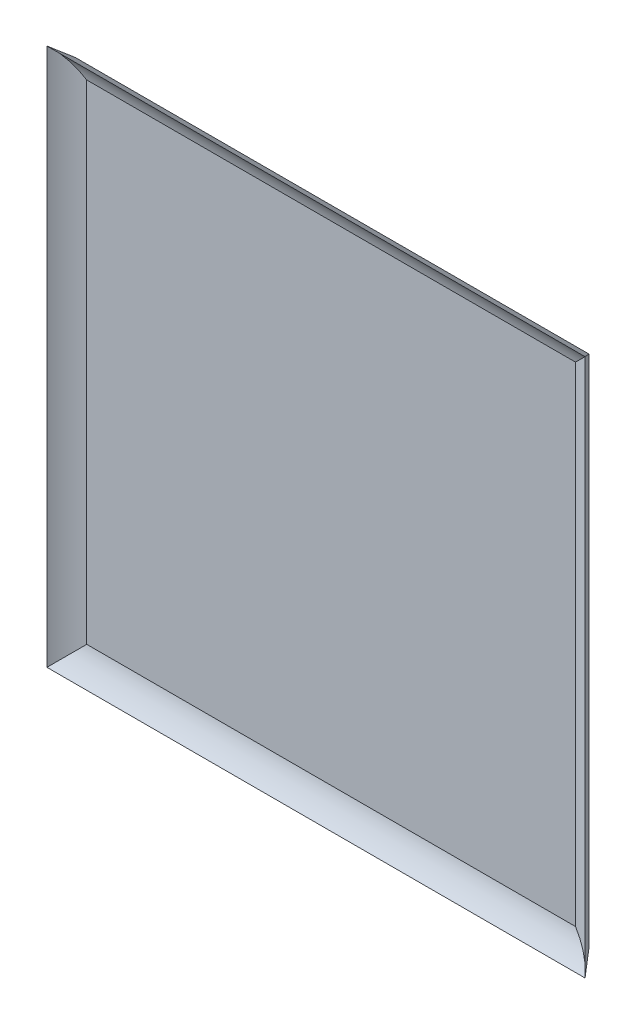
ISO-10303-21;
HEADER;
FILE_DESCRIPTION(('STEP AP214'),'2;1');
FILE_NAME('part.step','',(''),(''),'','','');
FILE_SCHEMA(('AUTOMOTIVE_DESIGN { 1 0 10303 214 1 1 1 1 }'));
ENDSEC;
DATA;
#1=APPLICATION_CONTEXT('core data for automotive mechanical design processes');
#2=APPLICATION_PROTOCOL_DEFINITION('international standard','automotive_design',2000,#1);
#3=PRODUCT_CONTEXT('',#1,'mechanical');
#4=PRODUCT('Part','Part','',(#3));
#5=PRODUCT_RELATED_PRODUCT_CATEGORY('part','',(#4));
#6=PRODUCT_DEFINITION_FORMATION('','',#4);
#7=PRODUCT_DEFINITION_CONTEXT('part definition',#1,'design');
#8=PRODUCT_DEFINITION('design','',#6,#7);
#9=PRODUCT_DEFINITION_SHAPE('','',#8);
#10=(LENGTH_UNIT() NAMED_UNIT(*) SI_UNIT(.MILLI.,.METRE.));
#11=(NAMED_UNIT(*) PLANE_ANGLE_UNIT() SI_UNIT($,.RADIAN.));
#12=(NAMED_UNIT(*) SI_UNIT($,.STERADIAN.) SOLID_ANGLE_UNIT());
#13=UNCERTAINTY_MEASURE_WITH_UNIT(LENGTH_MEASURE(1.E-05),#10,'distance_accuracy_value','');
#14=(GEOMETRIC_REPRESENTATION_CONTEXT(3) GLOBAL_UNCERTAINTY_ASSIGNED_CONTEXT((#13)) GLOBAL_UNIT_ASSIGNED_CONTEXT((#10,
#11,#12)) REPRESENTATION_CONTEXT('',''));
#15=CARTESIAN_POINT('',(0.,0.,0.));
#16=DIRECTION('',(0.,0.,1.));
#17=DIRECTION('',(1.,0.,0.));
#18=AXIS2_PLACEMENT_3D('',#15,#16,#17);
#19=CARTESIAN_POINT('',(170.657185783772,232.5,9.19000000000002));
#20=DIRECTION('',(-0.799236820228577,0.,0.601016227061227));
#21=DIRECTION('',(0.601016227061227,0.,0.799236820228577));
#22=AXIS2_PLACEMENT_3D('',#19,#20,#21);
#23=PLANE('',#22);
#24=DIRECTION('',(-0.517540186366875,-0.508421221063521,-0.688229625537595));
#25=VECTOR('',#24,1.);
#26=CARTESIAN_POINT('',(226.424839031571,75.3442114000021,83.3503301982734));
#27=LINE('',#26,#25);
#28=CARTESIAN_POINT('',(170.657185783772,20.5591742048539,9.19));
#29=VERTEX_POINT('',#28);
#30=CARTESIAN_POINT('',(166.303177226347,16.281882497659,3.4));
#31=VERTEX_POINT('',#30);
#32=EDGE_CURVE('E280',#29,#31,#27,.T.);
#33=ORIENTED_EDGE('',*,*,#32,.F.);
#34=DIRECTION('',(0.,-1.,0.));
#35=VECTOR('',#34,1.);
#36=CARTESIAN_POINT('',(170.657185783772,1.3439849596445E-13,9.19));
#37=LINE('',#36,#35);
#38=CARTESIAN_POINT('',(170.657185783772,-170.725630969198,9.19000000000001));
#39=VERTEX_POINT('',#38);
#40=EDGE_CURVE('E272',#29,#39,#37,.T.);
#41=ORIENTED_EDGE('',*,*,#40,.T.);
#42=DIRECTION('',(-0.513448036426635,0.519780597174714,-0.682787847497544));
#43=VECTOR('',#42,1.);
#44=CARTESIAN_POINT('',(63.0441975391485,-61.7854085411813,-133.914726074503));
#45=LINE('',#44,#43);
#46=CARTESIAN_POINT('',(166.303177226347,-166.317922676392,3.4));
#47=VERTEX_POINT('',#46);
#48=EDGE_CURVE('E283',#39,#47,#45,.T.);
#49=ORIENTED_EDGE('',*,*,#48,.T.);
#50=DIRECTION('',(0.,-1.,0.));
#51=VECTOR('',#50,1.);
#52=CARTESIAN_POINT('',(166.303177226347,232.5,3.4));
#53=LINE('',#52,#51);
#54=EDGE_CURVE('E278',#31,#47,#53,.T.);
#55=ORIENTED_EDGE('',*,*,#54,.F.);
#56=EDGE_LOOP('',(#33,#41,#49,#55));
#57=FACE_BOUND('',#56,.T.);
#58=ADVANCED_FACE('F184',(#57),#23,.F.);
#59=CARTESIAN_POINT('',(158.338261317732,1.24696912567703E-13,19.4));
#60=DIRECTION('',(0.,-1.,0.));
#61=DIRECTION('',(1.,0.,0.));
#62=AXIS2_PLACEMENT_3D('',#59,#60,#61);
#63=CYLINDRICAL_SURFACE('',#62,16.);
#64=CARTESIAN_POINT('',(158.338261317732,8.24024973881385,19.4));
#65=DIRECTION('',(0.707106781186548,-0.707106781186547,0.));
#66=DIRECTION('',(0.707106781186547,0.707106781186548,0.));
#67=AXIS2_PLACEMENT_3D('',#64,#65,#66);
#68=ELLIPSE('',#67,22.6274169979695,16.);
#69=CARTESIAN_POINT('',(161.893539084658,11.7955275057401,3.8));
#70=VERTEX_POINT('',#69);
#71=EDGE_CURVE('E205',#70,#29,#68,.T.);
#72=ORIENTED_EDGE('',*,*,#71,.F.);
#73=DIRECTION('',(0.,-1.,0.));
#74=VECTOR('',#73,1.);
#75=CARTESIAN_POINT('',(161.893539084658,1.27496818018014E-13,3.8));
#76=LINE('',#75,#74);
#77=CARTESIAN_POINT('',(161.893539084658,-161.961984270084,3.8));
#78=VERTEX_POINT('',#77);
#79=EDGE_CURVE('E249',#70,#78,#76,.T.);
#80=ORIENTED_EDGE('',*,*,#79,.T.);
#81=CARTESIAN_POINT('',(158.338261317732,-158.406706503158,19.4));
#82=DIRECTION('',(-0.707106781186547,-0.707106781186548,0.));
#83=DIRECTION('',(0.707106781186548,-0.707106781186547,0.));
#84=AXIS2_PLACEMENT_3D('',#81,#82,#83);
#85=ELLIPSE('',#84,22.6274169979695,16.);
#86=EDGE_CURVE('E248',#39,#78,#85,.F.);
#87=ORIENTED_EDGE('',*,*,#86,.F.);
#88=ORIENTED_EDGE('',*,*,#40,.F.);
#89=EDGE_LOOP('',(#72,#80,#87,#88));
#90=FACE_BOUND('',#89,.T.);
#91=ADVANCED_FACE('F186',(#90),#63,.F.);
#92=CARTESIAN_POINT('',(0.,-158.406706503158,19.4));
#93=DIRECTION('',(-1.,0.,0.));
#94=DIRECTION('',(0.,0.,1.));
#95=AXIS2_PLACEMENT_3D('',#92,#93,#94);
#96=CYLINDRICAL_SURFACE('',#95,16.);
#97=ORIENTED_EDGE('',*,*,#86,.T.);
#98=DIRECTION('',(-1.,0.,0.));
#99=VECTOR('',#98,1.);
#100=CARTESIAN_POINT('',(0.,-161.961984270084,3.8));
#101=LINE('',#100,#99);
#102=CARTESIAN_POINT('',(-11.8641614486881,-161.961984270084,3.8));
#103=VERTEX_POINT('',#102);
#104=EDGE_CURVE('E236',#78,#103,#101,.T.);
#105=ORIENTED_EDGE('',*,*,#104,.T.);
#106=CARTESIAN_POINT('',(-8.30888368176183,-158.406706503158,19.4));
#107=DIRECTION('',(-0.707106781186548,0.707106781186547,0.));
#108=DIRECTION('',(0.707106781186547,0.707106781186548,0.));
#109=AXIS2_PLACEMENT_3D('',#106,#107,#108);
#110=ELLIPSE('',#109,22.6274169979695,16.);
#111=CARTESIAN_POINT('',(-20.6278081478019,-170.725630969198,9.19000000000001));
#112=VERTEX_POINT('',#111);
#113=EDGE_CURVE('E246',#112,#103,#110,.F.);
#114=ORIENTED_EDGE('',*,*,#113,.F.);
#115=DIRECTION('',(-1.,0.,0.));
#116=VECTOR('',#115,1.);
#117=CARTESIAN_POINT('',(0.,-170.725630969198,9.19));
#118=LINE('',#117,#116);
#119=EDGE_CURVE('E268',#39,#112,#118,.T.);
#120=ORIENTED_EDGE('',*,*,#119,.F.);
#121=EDGE_LOOP('',(#97,#105,#114,#120));
#122=FACE_BOUND('',#121,.T.);
#123=ADVANCED_FACE('F244',(#122),#96,.F.);
#124=CARTESIAN_POINT('',(0.,8.24024973881384,19.4));
#125=DIRECTION('',(1.,0.,0.));
#126=DIRECTION('',(0.,1.,0.));
#127=AXIS2_PLACEMENT_3D('',#124,#125,#126);
#128=CYLINDRICAL_SURFACE('',#127,16.);
#129=CARTESIAN_POINT('',(-8.30888368176198,8.24024973881384,19.4));
#130=DIRECTION('',(0.707106781186547,0.707106781186548,0.));
#131=DIRECTION('',(-0.707106781186548,0.707106781186547,0.));
#132=AXIS2_PLACEMENT_3D('',#129,#130,#131);
#133=ELLIPSE('',#132,22.6274169979695,16.);
#134=CARTESIAN_POINT('',(-11.8641614486882,11.7955275057401,3.8));
#135=VERTEX_POINT('',#134);
#136=CARTESIAN_POINT('',(-20.6278081478018,20.5591742048539,9.18999999999999));
#137=VERTEX_POINT('',#136);
#138=EDGE_CURVE('E255',#135,#137,#133,.T.);
#139=ORIENTED_EDGE('',*,*,#138,.F.);
#140=DIRECTION('',(1.,0.,0.));
#141=VECTOR('',#140,1.);
#142=CARTESIAN_POINT('',(0.,11.7955275057401,3.8));
#143=LINE('',#142,#141);
#144=EDGE_CURVE('E199',#135,#70,#143,.T.);
#145=ORIENTED_EDGE('',*,*,#144,.T.);
#146=ORIENTED_EDGE('',*,*,#71,.T.);
#147=DIRECTION('',(1.,0.,0.));
#148=VECTOR('',#147,1.);
#149=CARTESIAN_POINT('',(0.,20.5591742048539,9.19));
#150=LINE('',#149,#148);
#151=EDGE_CURVE('E263',#137,#29,#150,.T.);
#152=ORIENTED_EDGE('',*,*,#151,.F.);
#153=EDGE_LOOP('',(#139,#145,#146,#152));
#154=FACE_BOUND('',#153,.T.);
#155=ADVANCED_FACE('F295',(#154),#128,.F.);
#156=CARTESIAN_POINT('',(-8.30888368176198,0.,19.4));
#157=DIRECTION('',(0.,1.,0.));
#158=DIRECTION('',(-1.,0.,0.));
#159=AXIS2_PLACEMENT_3D('',#156,#157,#158);
#160=CYLINDRICAL_SURFACE('',#159,16.);
#161=ORIENTED_EDGE('',*,*,#113,.T.);
#162=DIRECTION('',(0.,1.,0.));
#163=VECTOR('',#162,1.);
#164=CARTESIAN_POINT('',(-11.8641614486882,0.,3.8));
#165=LINE('',#164,#163);
#166=EDGE_CURVE('E12',#103,#135,#165,.T.);
#167=ORIENTED_EDGE('',*,*,#166,.T.);
#168=ORIENTED_EDGE('',*,*,#138,.T.);
#169=DIRECTION('',(0.,-1.,0.));
#170=VECTOR('',#169,1.);
#171=CARTESIAN_POINT('',(-20.627808147802,0.,9.19000000000001));
#172=LINE('',#171,#170);
#173=EDGE_CURVE('E254',#137,#112,#172,.T.);
#174=ORIENTED_EDGE('',*,*,#173,.T.);
#175=EDGE_LOOP('',(#161,#167,#168,#174));
#176=FACE_BOUND('',#175,.T.);
#177=ADVANCED_FACE('F252',(#176),#160,.F.);
#178=CARTESIAN_POINT('',(-20.6278081478019,232.5,9.19000000000001));
#179=DIRECTION('',(0.800763341591864,0.,0.598980860097075));
#180=DIRECTION('',(0.598980860097075,0.,-0.800763341591864));
#181=AXIS2_PLACEMENT_3D('',#178,#179,#180);
#182=PLANE('',#181);
#183=ORIENTED_EDGE('',*,*,#173,.F.);
#184=DIRECTION('',(0.515532809054972,-0.509140744837563,-0.689203616309535));
#185=VECTOR('',#184,1.);
#186=CARTESIAN_POINT('',(-76.2577729547584,75.4993860005325,83.5603838954667));
#187=LINE('',#186,#185);
#188=CARTESIAN_POINT('',(-16.2968167052269,16.281882497659,3.4));
#189=VERTEX_POINT('',#188);
#190=EDGE_CURVE('E289',#137,#189,#187,.T.);
#191=ORIENTED_EDGE('',*,*,#190,.T.);
#192=DIRECTION('',(0.,-1.,0.));
#193=VECTOR('',#192,1.);
#194=CARTESIAN_POINT('',(-16.2968167052269,232.5,3.4));
#195=LINE('',#194,#193);
#196=CARTESIAN_POINT('',(-16.2968167052269,-166.317922676392,3.4));
#197=VERTEX_POINT('',#196);
#198=EDGE_CURVE('E258',#189,#197,#195,.T.);
#199=ORIENTED_EDGE('',*,*,#198,.T.);
#200=DIRECTION('',(-0.511445122490858,-0.520504585984014,0.683738884845612));
#201=VECTOR('',#200,1.);
#202=CARTESIAN_POINT('',(86.7146982563193,-61.4817172091986,-134.313657377432));
#203=LINE('',#202,#201);
#204=EDGE_CURVE('E291',#197,#112,#203,.T.);
#205=ORIENTED_EDGE('',*,*,#204,.T.);
#206=EDGE_LOOP('',(#183,#191,#199,#205));
#207=FACE_BOUND('',#206,.T.);
#208=ADVANCED_FACE('F304',(#207),#182,.F.);
#209=CARTESIAN_POINT('',(-16.2968167052269,232.5,3.4));
#210=DIRECTION('',(0.,0.,1.));
#211=DIRECTION('',(1.,0.,0.));
#212=AXIS2_PLACEMENT_3D('',#209,#210,#211);
#213=PLANE('',#212);
#214=ORIENTED_EDGE('',*,*,#54,.T.);
#215=DIRECTION('',(-1.,0.,0.));
#216=VECTOR('',#215,1.);
#217=CARTESIAN_POINT('',(-16.2968167052269,-166.317922676392,3.4));
#218=LINE('',#217,#216);
#219=EDGE_CURVE('E192',#47,#197,#218,.T.);
#220=ORIENTED_EDGE('',*,*,#219,.T.);
#221=ORIENTED_EDGE('',*,*,#198,.F.);
#222=DIRECTION('',(-1.,0.,0.));
#223=VECTOR('',#222,1.);
#224=CARTESIAN_POINT('',(383.703183294773,16.281882497659,3.4));
#225=LINE('',#224,#223);
#226=EDGE_CURVE('E286',#31,#189,#225,.T.);
#227=ORIENTED_EDGE('',*,*,#226,.F.);
#228=EDGE_LOOP('',(#214,#220,#221,#227));
#229=FACE_BOUND('',#228,.T.);
#230=ADVANCED_FACE('F302',(#229),#213,.F.);
#231=CARTESIAN_POINT('',(383.703183294773,20.5591742048539,9.19000000000001));
#232=DIRECTION('',(0.,0.804327079908715,-0.594186795987187));
#233=DIRECTION('',(0.,0.594186795987187,0.804327079908715));
#234=AXIS2_PLACEMENT_3D('',#231,#232,#233);
#235=PLANE('',#234);
#236=ORIENTED_EDGE('',*,*,#32,.T.);
#237=ORIENTED_EDGE('',*,*,#226,.T.);
#238=ORIENTED_EDGE('',*,*,#190,.F.);
#239=ORIENTED_EDGE('',*,*,#151,.T.);
#240=EDGE_LOOP('',(#236,#237,#238,#239));
#241=FACE_BOUND('',#240,.T.);
#242=ADVANCED_FACE('F301',(#241),#235,.T.);
#243=CARTESIAN_POINT('',(383.703183294773,-170.725630969198,9.19000000000001));
#244=DIRECTION('',(0.,0.795678111064035,0.60571969059423));
#245=DIRECTION('',(0.,-0.60571969059423,0.795678111064035));
#246=AXIS2_PLACEMENT_3D('',#243,#244,#245);
#247=PLANE('',#246);
#248=ORIENTED_EDGE('',*,*,#119,.T.);
#249=ORIENTED_EDGE('',*,*,#204,.F.);
#250=ORIENTED_EDGE('',*,*,#219,.F.);
#251=ORIENTED_EDGE('',*,*,#48,.F.);
#252=EDGE_LOOP('',(#248,#249,#250,#251));
#253=FACE_BOUND('',#252,.T.);
#254=ADVANCED_FACE('F306',(#253),#247,.F.);
#255=CARTESIAN_POINT('',(0.,0.,3.8));
#256=DIRECTION('',(0.,0.,1.));
#257=DIRECTION('',(1.,0.,0.));
#258=AXIS2_PLACEMENT_3D('',#255,#256,#257);
#259=PLANE('',#258);
#260=ORIENTED_EDGE('',*,*,#79,.F.);
#261=ORIENTED_EDGE('',*,*,#144,.F.);
#262=ORIENTED_EDGE('',*,*,#166,.F.);
#263=ORIENTED_EDGE('',*,*,#104,.F.);
#264=EDGE_LOOP('',(#260,#261,#262,#263));
#265=FACE_BOUND('',#264,.T.);
#266=ADVANCED_FACE('F235',(#265),#259,.T.);
#267=CLOSED_SHELL('',(#58,#91,#123,#155,#177,#208,#230,#242,#254,#266));
#268=MANIFOLD_SOLID_BREP('B2',#267);
#269=ADVANCED_BREP_SHAPE_REPRESENTATION('',(#18,#268),#14);
#270=SHAPE_DEFINITION_REPRESENTATION(#9,#269);
ENDSEC;
END-ISO-10303-21;
